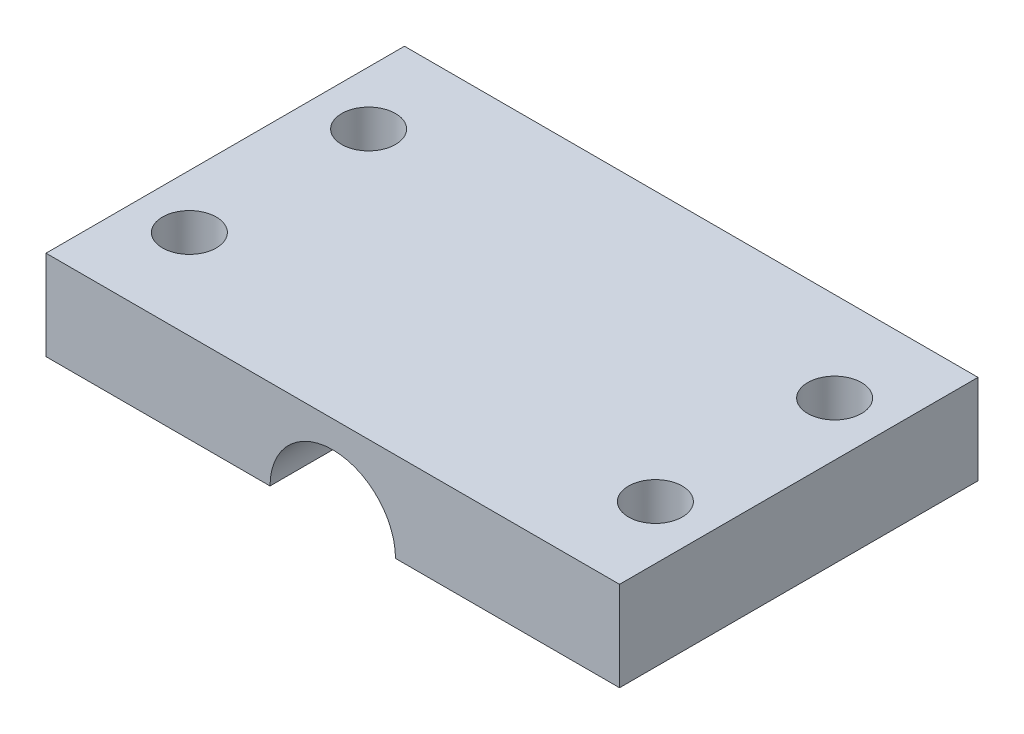
ISO-10303-21;
HEADER;
FILE_DESCRIPTION(('STEP AP214'),'2;1');
FILE_NAME('part.step','',(''),(''),'','','');
FILE_SCHEMA(('AUTOMOTIVE_DESIGN { 1 0 10303 214 1 1 1 1 }'));
ENDSEC;
DATA;
#1=APPLICATION_CONTEXT('core data for automotive mechanical design processes');
#2=APPLICATION_PROTOCOL_DEFINITION('international standard','automotive_design',2000,#1);
#3=PRODUCT_CONTEXT('',#1,'mechanical');
#4=PRODUCT('Part','Part','',(#3));
#5=PRODUCT_RELATED_PRODUCT_CATEGORY('part','',(#4));
#6=PRODUCT_DEFINITION_FORMATION('','',#4);
#7=PRODUCT_DEFINITION_CONTEXT('part definition',#1,'design');
#8=PRODUCT_DEFINITION('design','',#6,#7);
#9=PRODUCT_DEFINITION_SHAPE('','',#8);
#10=(LENGTH_UNIT() NAMED_UNIT(*) SI_UNIT(.MILLI.,.METRE.));
#11=(NAMED_UNIT(*) PLANE_ANGLE_UNIT() SI_UNIT($,.RADIAN.));
#12=(NAMED_UNIT(*) SI_UNIT($,.STERADIAN.) SOLID_ANGLE_UNIT());
#13=UNCERTAINTY_MEASURE_WITH_UNIT(LENGTH_MEASURE(1.E-05),#10,'distance_accuracy_value','');
#14=(GEOMETRIC_REPRESENTATION_CONTEXT(3) GLOBAL_UNCERTAINTY_ASSIGNED_CONTEXT((#13)) GLOBAL_UNIT_ASSIGNED_CONTEXT((#10,
#11,#12)) REPRESENTATION_CONTEXT('',''));
#15=CARTESIAN_POINT('',(0.,0.,0.));
#16=DIRECTION('',(0.,0.,1.));
#17=DIRECTION('',(1.,0.,0.));
#18=AXIS2_PLACEMENT_3D('',#15,#16,#17);
#19=CARTESIAN_POINT('',(11.635150199107,-2.18054666619971,20.));
#20=DIRECTION('',(0.,0.,-1.));
#21=DIRECTION('',(-1.,0.,0.));
#22=AXIS2_PLACEMENT_3D('',#19,#20,#21);
#23=CYLINDRICAL_SURFACE('',#22,3.5);
#24=CARTESIAN_POINT('',(11.635150199107,-2.18054666619971,0.));
#25=DIRECTION('',(0.,0.,-1.));
#26=DIRECTION('',(-1.,0.,0.));
#27=AXIS2_PLACEMENT_3D('',#24,#25,#26);
#28=CIRCLE('',#27,3.5);
#29=CARTESIAN_POINT('',(8.13515019910697,-2.18054666619971,0.));
#30=VERTEX_POINT('',#29);
#31=CARTESIAN_POINT('',(15.135150199107,-2.18054666619971,0.));
#32=VERTEX_POINT('',#31);
#33=EDGE_CURVE('E134',#30,#32,#28,.T.);
#34=ORIENTED_EDGE('',*,*,#33,.T.);
#35=DIRECTION('',(0.,0.,-1.));
#36=VECTOR('',#35,1.);
#37=CARTESIAN_POINT('',(15.135150199107,-2.18054666619971,20.));
#38=LINE('',#37,#36);
#39=CARTESIAN_POINT('',(15.135150199107,-2.18054666619971,20.));
#40=VERTEX_POINT('',#39);
#41=EDGE_CURVE('E11',#40,#32,#38,.T.);
#42=ORIENTED_EDGE('',*,*,#41,.F.);
#43=CARTESIAN_POINT('',(11.635150199107,-2.18054666619971,20.));
#44=DIRECTION('',(0.,0.,-1.));
#45=DIRECTION('',(-1.,0.,0.));
#46=AXIS2_PLACEMENT_3D('',#43,#44,#45);
#47=CIRCLE('',#46,3.5);
#48=CARTESIAN_POINT('',(8.13515019910697,-2.18054666619971,20.));
#49=VERTEX_POINT('',#48);
#50=EDGE_CURVE('E151',#49,#40,#47,.T.);
#51=ORIENTED_EDGE('',*,*,#50,.F.);
#52=DIRECTION('',(0.,0.,-1.));
#53=VECTOR('',#52,1.);
#54=CARTESIAN_POINT('',(8.13515019910697,-2.18054666619971,20.));
#55=LINE('',#54,#53);
#56=EDGE_CURVE('E130',#49,#30,#55,.T.);
#57=ORIENTED_EDGE('',*,*,#56,.T.);
#58=EDGE_LOOP('',(#34,#42,#51,#57));
#59=FACE_BOUND('',#58,.T.);
#60=ADVANCED_FACE('F45',(#59),#23,.F.);
#61=CARTESIAN_POINT('',(27.635150199107,-2.18054666619971,20.));
#62=DIRECTION('',(0.,1.,0.));
#63=DIRECTION('',(-1.,0.,0.));
#64=AXIS2_PLACEMENT_3D('',#61,#62,#63);
#65=PLANE('',#64);
#66=CARTESIAN_POINT('',(24.635150199107,-2.18054666619971,15.));
#67=DIRECTION('',(0.,-1.,0.));
#68=DIRECTION('',(1.,0.,0.));
#69=AXIS2_PLACEMENT_3D('',#66,#67,#68);
#70=CIRCLE('',#69,1.5);
#71=CARTESIAN_POINT('',(26.135150199107,-2.18054666619971,15.));
#72=VERTEX_POINT('',#71);
#73=EDGE_CURVE('E228',#72,#72,#70,.T.);
#74=ORIENTED_EDGE('',*,*,#73,.F.);
#75=EDGE_LOOP('',(#74));
#76=FACE_BOUND('',#75,.T.);
#77=CARTESIAN_POINT('',(24.635150199107,-2.18054666619971,5.));
#78=DIRECTION('',(0.,-1.,0.));
#79=DIRECTION('',(1.,0.,0.));
#80=AXIS2_PLACEMENT_3D('',#77,#78,#79);
#81=CIRCLE('',#80,1.5);
#82=CARTESIAN_POINT('',(26.135150199107,-2.18054666619971,5.));
#83=VERTEX_POINT('',#82);
#84=EDGE_CURVE('E234',#83,#83,#81,.T.);
#85=ORIENTED_EDGE('',*,*,#84,.F.);
#86=EDGE_LOOP('',(#85));
#87=FACE_BOUND('',#86,.T.);
#88=DIRECTION('',(1.,0.,0.));
#89=VECTOR('',#88,1.);
#90=CARTESIAN_POINT('',(27.635150199107,-2.18054666619971,0.));
#91=LINE('',#90,#89);
#92=CARTESIAN_POINT('',(27.635150199107,-2.18054666619971,0.));
#93=VERTEX_POINT('',#92);
#94=EDGE_CURVE('E138',#32,#93,#91,.T.);
#95=ORIENTED_EDGE('',*,*,#94,.T.);
#96=DIRECTION('',(0.,0.,-1.));
#97=VECTOR('',#96,1.);
#98=CARTESIAN_POINT('',(27.635150199107,-2.18054666619971,20.));
#99=LINE('',#98,#97);
#100=CARTESIAN_POINT('',(27.635150199107,-2.18054666619971,20.));
#101=VERTEX_POINT('',#100);
#102=EDGE_CURVE('E54',#101,#93,#99,.T.);
#103=ORIENTED_EDGE('',*,*,#102,.F.);
#104=DIRECTION('',(1.,0.,0.));
#105=VECTOR('',#104,1.);
#106=CARTESIAN_POINT('',(27.635150199107,-2.18054666619971,20.));
#107=LINE('',#106,#105);
#108=EDGE_CURVE('E99',#40,#101,#107,.T.);
#109=ORIENTED_EDGE('',*,*,#108,.F.);
#110=ORIENTED_EDGE('',*,*,#41,.T.);
#111=EDGE_LOOP('',(#95,#103,#109,#110));
#112=FACE_BOUND('',#111,.T.);
#113=ADVANCED_FACE('F184',(#76,#87,#112),#65,.F.);
#114=CARTESIAN_POINT('',(27.635150199107,2.81945333380029,20.));
#115=DIRECTION('',(-1.,0.,0.));
#116=DIRECTION('',(0.,-1.,0.));
#117=AXIS2_PLACEMENT_3D('',#114,#115,#116);
#118=PLANE('',#117);
#119=DIRECTION('',(0.,1.,0.));
#120=VECTOR('',#119,1.);
#121=CARTESIAN_POINT('',(27.635150199107,2.81945333380029,0.));
#122=LINE('',#121,#120);
#123=CARTESIAN_POINT('',(27.635150199107,2.81945333380029,0.));
#124=VERTEX_POINT('',#123);
#125=EDGE_CURVE('E142',#93,#124,#122,.T.);
#126=ORIENTED_EDGE('',*,*,#125,.T.);
#127=DIRECTION('',(0.,0.,-1.));
#128=VECTOR('',#127,1.);
#129=CARTESIAN_POINT('',(27.635150199107,2.81945333380029,20.));
#130=LINE('',#129,#128);
#131=CARTESIAN_POINT('',(27.635150199107,2.81945333380029,20.));
#132=VERTEX_POINT('',#131);
#133=EDGE_CURVE('E123',#132,#124,#130,.T.);
#134=ORIENTED_EDGE('',*,*,#133,.F.);
#135=DIRECTION('',(0.,1.,0.));
#136=VECTOR('',#135,1.);
#137=CARTESIAN_POINT('',(27.635150199107,2.81945333380029,20.));
#138=LINE('',#137,#136);
#139=EDGE_CURVE('E112',#101,#132,#138,.T.);
#140=ORIENTED_EDGE('',*,*,#139,.F.);
#141=ORIENTED_EDGE('',*,*,#102,.T.);
#142=EDGE_LOOP('',(#126,#134,#140,#141));
#143=FACE_BOUND('',#142,.T.);
#144=ADVANCED_FACE('F161',(#143),#118,.F.);
#145=CARTESIAN_POINT('',(-4.36484980089303,2.81945333380029,20.));
#146=DIRECTION('',(0.,-1.,0.));
#147=DIRECTION('',(0.,0.,-1.));
#148=AXIS2_PLACEMENT_3D('',#145,#146,#147);
#149=PLANE('',#148);
#150=CARTESIAN_POINT('',(-1.36484980089303,2.81945333380029,5.));
#151=DIRECTION('',(0.,-1.,0.));
#152=DIRECTION('',(0.,0.,-1.));
#153=AXIS2_PLACEMENT_3D('',#150,#151,#152);
#154=CIRCLE('',#153,1.5);
#155=CARTESIAN_POINT('',(-1.36484980089303,2.81945333380029,3.5));
#156=VERTEX_POINT('',#155);
#157=EDGE_CURVE('E203',#156,#156,#154,.F.);
#158=ORIENTED_EDGE('',*,*,#157,.F.);
#159=EDGE_LOOP('',(#158));
#160=FACE_BOUND('',#159,.T.);
#161=CARTESIAN_POINT('',(24.635150199107,2.81945333380029,15.));
#162=DIRECTION('',(0.,-1.,0.));
#163=DIRECTION('',(0.,0.,-1.));
#164=AXIS2_PLACEMENT_3D('',#161,#162,#163);
#165=CIRCLE('',#164,1.5);
#166=CARTESIAN_POINT('',(24.635150199107,2.81945333380029,13.5));
#167=VERTEX_POINT('',#166);
#168=EDGE_CURVE('E207',#167,#167,#165,.F.);
#169=ORIENTED_EDGE('',*,*,#168,.F.);
#170=EDGE_LOOP('',(#169));
#171=FACE_BOUND('',#170,.T.);
#172=CARTESIAN_POINT('',(24.635150199107,2.81945333380029,5.));
#173=DIRECTION('',(0.,-1.,0.));
#174=DIRECTION('',(0.,0.,-1.));
#175=AXIS2_PLACEMENT_3D('',#172,#173,#174);
#176=CIRCLE('',#175,1.5);
#177=CARTESIAN_POINT('',(24.635150199107,2.81945333380029,3.5));
#178=VERTEX_POINT('',#177);
#179=EDGE_CURVE('E211',#178,#178,#176,.F.);
#180=ORIENTED_EDGE('',*,*,#179,.F.);
#181=EDGE_LOOP('',(#180));
#182=FACE_BOUND('',#181,.T.);
#183=CARTESIAN_POINT('',(-1.36484980089303,2.81945333380029,15.));
#184=DIRECTION('',(0.,-1.,0.));
#185=DIRECTION('',(0.,0.,-1.));
#186=AXIS2_PLACEMENT_3D('',#183,#184,#185);
#187=CIRCLE('',#186,1.5);
#188=CARTESIAN_POINT('',(-1.36484980089303,2.81945333380029,13.5));
#189=VERTEX_POINT('',#188);
#190=EDGE_CURVE('E139',#189,#189,#187,.F.);
#191=ORIENTED_EDGE('',*,*,#190,.F.);
#192=EDGE_LOOP('',(#191));
#193=FACE_BOUND('',#192,.T.);
#194=DIRECTION('',(-1.,0.,0.));
#195=VECTOR('',#194,1.);
#196=CARTESIAN_POINT('',(-4.36484980089303,2.81945333380029,0.));
#197=LINE('',#196,#195);
#198=CARTESIAN_POINT('',(-4.36484980089303,2.81945333380029,0.));
#199=VERTEX_POINT('',#198);
#200=EDGE_CURVE('E121',#124,#199,#197,.T.);
#201=ORIENTED_EDGE('',*,*,#200,.T.);
#202=DIRECTION('',(0.,0.,-1.));
#203=VECTOR('',#202,1.);
#204=CARTESIAN_POINT('',(-4.36484980089303,2.81945333380029,20.));
#205=LINE('',#204,#203);
#206=CARTESIAN_POINT('',(-4.36484980089303,2.81945333380029,20.));
#207=VERTEX_POINT('',#206);
#208=EDGE_CURVE('E118',#207,#199,#205,.T.);
#209=ORIENTED_EDGE('',*,*,#208,.F.);
#210=DIRECTION('',(-1.,0.,0.));
#211=VECTOR('',#210,1.);
#212=CARTESIAN_POINT('',(-4.36484980089303,2.81945333380029,20.));
#213=LINE('',#212,#211);
#214=EDGE_CURVE('E106',#132,#207,#213,.T.);
#215=ORIENTED_EDGE('',*,*,#214,.F.);
#216=ORIENTED_EDGE('',*,*,#133,.T.);
#217=EDGE_LOOP('',(#201,#209,#215,#216));
#218=FACE_BOUND('',#217,.T.);
#219=ADVANCED_FACE('F119',(#160,#171,#182,#193,#218),#149,.F.);
#220=CARTESIAN_POINT('',(-4.36484980089303,-2.18054666619971,20.));
#221=DIRECTION('',(1.,0.,0.));
#222=DIRECTION('',(0.,0.,-1.));
#223=AXIS2_PLACEMENT_3D('',#220,#221,#222);
#224=PLANE('',#223);
#225=DIRECTION('',(0.,-1.,0.));
#226=VECTOR('',#225,1.);
#227=CARTESIAN_POINT('',(-4.36484980089303,-2.18054666619971,0.));
#228=LINE('',#227,#226);
#229=CARTESIAN_POINT('',(-4.36484980089303,-2.18054666619971,0.));
#230=VERTEX_POINT('',#229);
#231=EDGE_CURVE('E85',#199,#230,#228,.T.);
#232=ORIENTED_EDGE('',*,*,#231,.T.);
#233=DIRECTION('',(0.,0.,-1.));
#234=VECTOR('',#233,1.);
#235=CARTESIAN_POINT('',(-4.36484980089303,-2.18054666619971,20.));
#236=LINE('',#235,#234);
#237=CARTESIAN_POINT('',(-4.36484980089303,-2.18054666619971,20.));
#238=VERTEX_POINT('',#237);
#239=EDGE_CURVE('E124',#238,#230,#236,.T.);
#240=ORIENTED_EDGE('',*,*,#239,.F.);
#241=DIRECTION('',(0.,-1.,0.));
#242=VECTOR('',#241,1.);
#243=CARTESIAN_POINT('',(-4.36484980089303,-2.18054666619971,20.));
#244=LINE('',#243,#242);
#245=EDGE_CURVE('E110',#207,#238,#244,.T.);
#246=ORIENTED_EDGE('',*,*,#245,.F.);
#247=ORIENTED_EDGE('',*,*,#208,.T.);
#248=EDGE_LOOP('',(#232,#240,#246,#247));
#249=FACE_BOUND('',#248,.T.);
#250=ADVANCED_FACE('F126',(#249),#224,.F.);
#251=CARTESIAN_POINT('',(8.13515019910697,-2.18054666619971,20.));
#252=DIRECTION('',(0.,1.,0.));
#253=DIRECTION('',(-1.,0.,0.));
#254=AXIS2_PLACEMENT_3D('',#251,#252,#253);
#255=PLANE('',#254);
#256=CARTESIAN_POINT('',(-1.36484980089303,-2.18054666619971,5.));
#257=DIRECTION('',(0.,-1.,0.));
#258=DIRECTION('',(1.,0.,0.));
#259=AXIS2_PLACEMENT_3D('',#256,#257,#258);
#260=CIRCLE('',#259,1.5);
#261=CARTESIAN_POINT('',(0.135150199106975,-2.18054666619971,5.));
#262=VERTEX_POINT('',#261);
#263=EDGE_CURVE('E220',#262,#262,#260,.T.);
#264=ORIENTED_EDGE('',*,*,#263,.F.);
#265=EDGE_LOOP('',(#264));
#266=FACE_BOUND('',#265,.T.);
#267=CARTESIAN_POINT('',(-1.36484980089303,-2.18054666619971,15.));
#268=DIRECTION('',(0.,-1.,0.));
#269=DIRECTION('',(1.,0.,0.));
#270=AXIS2_PLACEMENT_3D('',#267,#268,#269);
#271=CIRCLE('',#270,1.5);
#272=CARTESIAN_POINT('',(0.135150199106975,-2.18054666619971,15.));
#273=VERTEX_POINT('',#272);
#274=EDGE_CURVE('E216',#273,#273,#271,.T.);
#275=ORIENTED_EDGE('',*,*,#274,.F.);
#276=EDGE_LOOP('',(#275));
#277=FACE_BOUND('',#276,.T.);
#278=DIRECTION('',(1.,0.,0.));
#279=VECTOR('',#278,1.);
#280=CARTESIAN_POINT('',(8.13515019910697,-2.18054666619971,0.));
#281=LINE('',#280,#279);
#282=EDGE_CURVE('E91',#230,#30,#281,.T.);
#283=ORIENTED_EDGE('',*,*,#282,.T.);
#284=ORIENTED_EDGE('',*,*,#56,.F.);
#285=DIRECTION('',(1.,0.,0.));
#286=VECTOR('',#285,1.);
#287=CARTESIAN_POINT('',(8.13515019910697,-2.18054666619971,20.));
#288=LINE('',#287,#286);
#289=EDGE_CURVE('E62',#238,#49,#288,.T.);
#290=ORIENTED_EDGE('',*,*,#289,.F.);
#291=ORIENTED_EDGE('',*,*,#239,.T.);
#292=EDGE_LOOP('',(#283,#284,#290,#291));
#293=FACE_BOUND('',#292,.T.);
#294=ADVANCED_FACE('F168',(#266,#277,#293),#255,.F.);
#295=CARTESIAN_POINT('',(11.635150199107,-2.18054666619971,20.));
#296=DIRECTION('',(0.,0.,-1.));
#297=DIRECTION('',(-1.,0.,0.));
#298=AXIS2_PLACEMENT_3D('',#295,#296,#297);
#299=PLANE('',#298);
#300=ORIENTED_EDGE('',*,*,#50,.T.);
#301=ORIENTED_EDGE('',*,*,#108,.T.);
#302=ORIENTED_EDGE('',*,*,#139,.T.);
#303=ORIENTED_EDGE('',*,*,#214,.T.);
#304=ORIENTED_EDGE('',*,*,#245,.T.);
#305=ORIENTED_EDGE('',*,*,#289,.T.);
#306=EDGE_LOOP('',(#300,#301,#302,#303,#304,#305));
#307=FACE_BOUND('',#306,.T.);
#308=ADVANCED_FACE('F108',(#307),#299,.F.);
#309=CARTESIAN_POINT('',(11.635150199107,-2.18054666619971,0.));
#310=DIRECTION('',(0.,0.,-1.));
#311=DIRECTION('',(-1.,0.,0.));
#312=AXIS2_PLACEMENT_3D('',#309,#310,#311);
#313=PLANE('',#312);
#314=ORIENTED_EDGE('',*,*,#33,.F.);
#315=ORIENTED_EDGE('',*,*,#282,.F.);
#316=ORIENTED_EDGE('',*,*,#231,.F.);
#317=ORIENTED_EDGE('',*,*,#200,.F.);
#318=ORIENTED_EDGE('',*,*,#125,.F.);
#319=ORIENTED_EDGE('',*,*,#94,.F.);
#320=EDGE_LOOP('',(#314,#315,#316,#317,#318,#319));
#321=FACE_BOUND('',#320,.T.);
#322=ADVANCED_FACE('F164',(#321),#313,.T.);
#323=CARTESIAN_POINT('',(-1.36484980089303,2.82045333380029,15.));
#324=DIRECTION('',(0.,-1.,0.));
#325=DIRECTION('',(1.,0.,0.));
#326=AXIS2_PLACEMENT_3D('',#323,#324,#325);
#327=CYLINDRICAL_SURFACE('',#326,1.5);
#328=ORIENTED_EDGE('',*,*,#274,.T.);
#329=EDGE_LOOP('',(#328));
#330=FACE_BOUND('',#329,.T.);
#331=ORIENTED_EDGE('',*,*,#190,.T.);
#332=EDGE_LOOP('',(#331));
#333=FACE_BOUND('',#332,.T.);
#334=ADVANCED_FACE('F257',(#330,#333),#327,.F.);
#335=CARTESIAN_POINT('',(-1.36484980089303,2.82045333380029,5.));
#336=DIRECTION('',(0.,-1.,0.));
#337=DIRECTION('',(1.,0.,0.));
#338=AXIS2_PLACEMENT_3D('',#335,#336,#337);
#339=CYLINDRICAL_SURFACE('',#338,1.5);
#340=ORIENTED_EDGE('',*,*,#263,.T.);
#341=EDGE_LOOP('',(#340));
#342=FACE_BOUND('',#341,.T.);
#343=ORIENTED_EDGE('',*,*,#157,.T.);
#344=EDGE_LOOP('',(#343));
#345=FACE_BOUND('',#344,.T.);
#346=ADVANCED_FACE('F248',(#342,#345),#339,.F.);
#347=CARTESIAN_POINT('',(24.635150199107,2.82045333380029,5.));
#348=DIRECTION('',(0.,-1.,0.));
#349=DIRECTION('',(1.,0.,0.));
#350=AXIS2_PLACEMENT_3D('',#347,#348,#349);
#351=CYLINDRICAL_SURFACE('',#350,1.5);
#352=ORIENTED_EDGE('',*,*,#84,.T.);
#353=EDGE_LOOP('',(#352));
#354=FACE_BOUND('',#353,.T.);
#355=ORIENTED_EDGE('',*,*,#179,.T.);
#356=EDGE_LOOP('',(#355));
#357=FACE_BOUND('',#356,.T.);
#358=ADVANCED_FACE('F245',(#354,#357),#351,.F.);
#359=CARTESIAN_POINT('',(24.635150199107,2.82045333380029,15.));
#360=DIRECTION('',(0.,-1.,0.));
#361=DIRECTION('',(1.,0.,0.));
#362=AXIS2_PLACEMENT_3D('',#359,#360,#361);
#363=CYLINDRICAL_SURFACE('',#362,1.5);
#364=ORIENTED_EDGE('',*,*,#73,.T.);
#365=EDGE_LOOP('',(#364));
#366=FACE_BOUND('',#365,.T.);
#367=ORIENTED_EDGE('',*,*,#168,.T.);
#368=EDGE_LOOP('',(#367));
#369=FACE_BOUND('',#368,.T.);
#370=ADVANCED_FACE('F247',(#366,#369),#363,.F.);
#371=CLOSED_SHELL('',(#60,#113,#144,#219,#250,#294,#308,#322,#334,#346,#358,#370));
#372=MANIFOLD_SOLID_BREP('B2',#371);
#373=ADVANCED_BREP_SHAPE_REPRESENTATION('',(#18,#372),#14);
#374=SHAPE_DEFINITION_REPRESENTATION(#9,#373);
ENDSEC;
END-ISO-10303-21;
